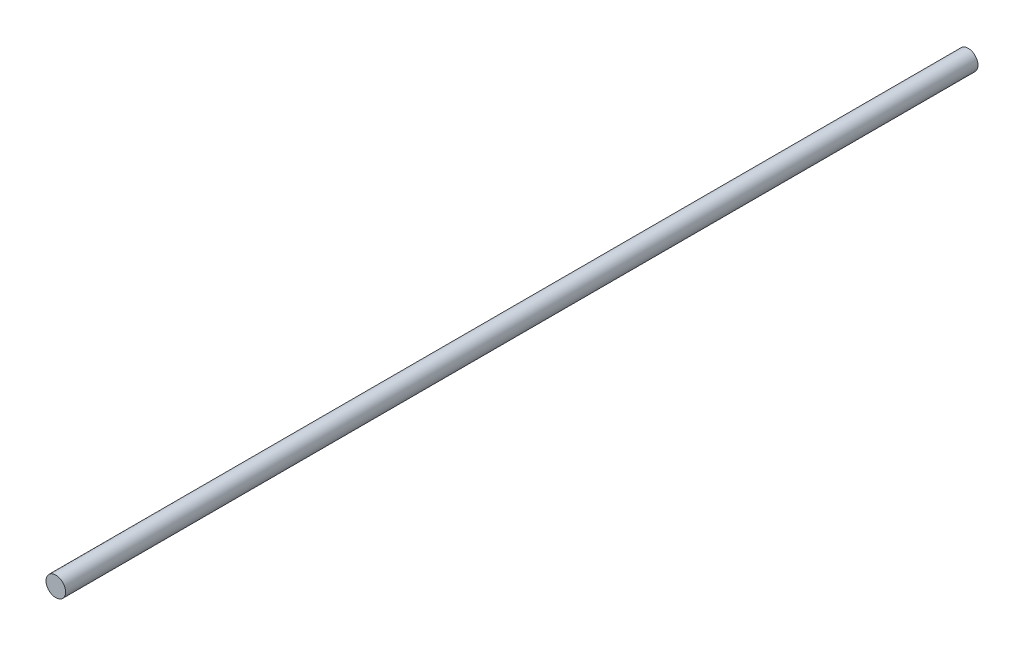
ISO-10303-21;
HEADER;
FILE_DESCRIPTION(('STEP AP214'),'2;1');
FILE_NAME('part.step','',(''),(''),'','','');
FILE_SCHEMA(('AUTOMOTIVE_DESIGN { 1 0 10303 214 1 1 1 1 }'));
ENDSEC;
DATA;
#1=APPLICATION_CONTEXT('core data for automotive mechanical design processes');
#2=APPLICATION_PROTOCOL_DEFINITION('international standard','automotive_design',2000,#1);
#3=PRODUCT_CONTEXT('',#1,'mechanical');
#4=PRODUCT('Part','Part','',(#3));
#5=PRODUCT_RELATED_PRODUCT_CATEGORY('part','',(#4));
#6=PRODUCT_DEFINITION_FORMATION('','',#4);
#7=PRODUCT_DEFINITION_CONTEXT('part definition',#1,'design');
#8=PRODUCT_DEFINITION('design','',#6,#7);
#9=PRODUCT_DEFINITION_SHAPE('','',#8);
#10=(LENGTH_UNIT() NAMED_UNIT(*) SI_UNIT(.MILLI.,.METRE.));
#11=(NAMED_UNIT(*) PLANE_ANGLE_UNIT() SI_UNIT($,.RADIAN.));
#12=(NAMED_UNIT(*) SI_UNIT($,.STERADIAN.) SOLID_ANGLE_UNIT());
#13=UNCERTAINTY_MEASURE_WITH_UNIT(LENGTH_MEASURE(1.E-05),#10,'distance_accuracy_value','');
#14=(GEOMETRIC_REPRESENTATION_CONTEXT(3) GLOBAL_UNCERTAINTY_ASSIGNED_CONTEXT((#13)) GLOBAL_UNIT_ASSIGNED_CONTEXT((#10,
#11,#12)) REPRESENTATION_CONTEXT('',''));
#15=CARTESIAN_POINT('',(0.,0.,0.));
#16=DIRECTION('',(0.,0.,1.));
#17=DIRECTION('',(1.,0.,0.));
#18=AXIS2_PLACEMENT_3D('',#15,#16,#17);
#19=CARTESIAN_POINT('',(0.,0.,295.275));
#20=DIRECTION('',(0.,0.,-1.));
#21=DIRECTION('',(-1.,0.,0.));
#22=AXIS2_PLACEMENT_3D('',#19,#20,#21);
#23=CYLINDRICAL_SURFACE('',#22,6.35);
#24=CARTESIAN_POINT('',(0.,0.,295.275));
#25=DIRECTION('',(0.,0.,1.));
#26=DIRECTION('',(1.,0.,0.));
#27=AXIS2_PLACEMENT_3D('',#24,#25,#26);
#28=CIRCLE('',#27,6.35);
#29=CARTESIAN_POINT('',(6.35,0.,295.275));
#30=VERTEX_POINT('',#29);
#31=EDGE_CURVE('E10',#30,#30,#28,.T.);
#32=ORIENTED_EDGE('',*,*,#31,.F.);
#33=EDGE_LOOP('',(#32));
#34=FACE_BOUND('',#33,.T.);
#35=CARTESIAN_POINT('',(0.,0.,-295.275));
#36=DIRECTION('',(0.,0.,1.));
#37=DIRECTION('',(1.,0.,0.));
#38=AXIS2_PLACEMENT_3D('',#35,#36,#37);
#39=CIRCLE('',#38,6.35);
#40=CARTESIAN_POINT('',(6.35,0.,-295.275));
#41=VERTEX_POINT('',#40);
#42=EDGE_CURVE('E34',#41,#41,#39,.T.);
#43=ORIENTED_EDGE('',*,*,#42,.T.);
#44=EDGE_LOOP('',(#43));
#45=FACE_BOUND('',#44,.T.);
#46=ADVANCED_FACE('F31',(#34,#45),#23,.T.);
#47=CARTESIAN_POINT('',(0.,0.,295.275));
#48=DIRECTION('',(0.,0.,1.));
#49=DIRECTION('',(1.,0.,0.));
#50=AXIS2_PLACEMENT_3D('',#47,#48,#49);
#51=PLANE('',#50);
#52=ORIENTED_EDGE('',*,*,#31,.T.);
#53=EDGE_LOOP('',(#52));
#54=FACE_BOUND('',#53,.T.);
#55=ADVANCED_FACE('F46',(#54),#51,.T.);
#56=CARTESIAN_POINT('',(0.,0.,-295.275));
#57=DIRECTION('',(0.,0.,1.));
#58=DIRECTION('',(1.,0.,0.));
#59=AXIS2_PLACEMENT_3D('',#56,#57,#58);
#60=PLANE('',#59);
#61=ORIENTED_EDGE('',*,*,#42,.F.);
#62=EDGE_LOOP('',(#61));
#63=FACE_BOUND('',#62,.T.);
#64=ADVANCED_FACE('F44',(#63),#60,.F.);
#65=CLOSED_SHELL('',(#46,#55,#64));
#66=MANIFOLD_SOLID_BREP('B2',#65);
#67=ADVANCED_BREP_SHAPE_REPRESENTATION('',(#18,#66),#14);
#68=SHAPE_DEFINITION_REPRESENTATION(#9,#67);
ENDSEC;
END-ISO-10303-21;
